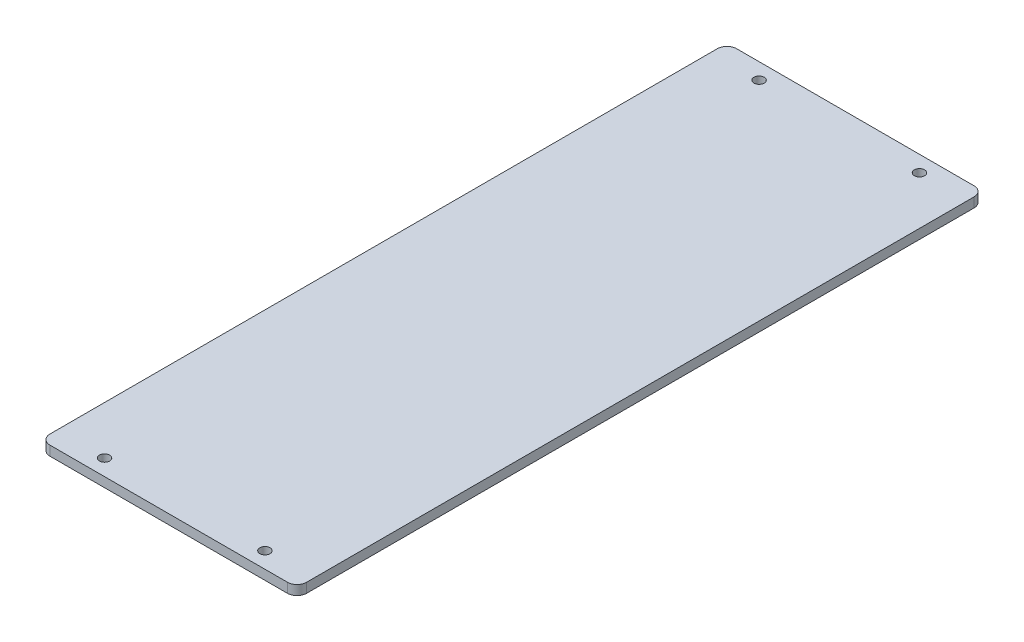
ISO-10303-21;
HEADER;
FILE_DESCRIPTION(('STEP AP214'),'2;1');
FILE_NAME('part.step','',(''),(''),'','','');
FILE_SCHEMA(('AUTOMOTIVE_DESIGN { 1 0 10303 214 1 1 1 1 }'));
ENDSEC;
DATA;
#1=APPLICATION_CONTEXT('core data for automotive mechanical design processes');
#2=APPLICATION_PROTOCOL_DEFINITION('international standard','automotive_design',2000,#1);
#3=PRODUCT_CONTEXT('',#1,'mechanical');
#4=PRODUCT('Part','Part','',(#3));
#5=PRODUCT_RELATED_PRODUCT_CATEGORY('part','',(#4));
#6=PRODUCT_DEFINITION_FORMATION('','',#4);
#7=PRODUCT_DEFINITION_CONTEXT('part definition',#1,'design');
#8=PRODUCT_DEFINITION('design','',#6,#7);
#9=PRODUCT_DEFINITION_SHAPE('','',#8);
#10=(LENGTH_UNIT() NAMED_UNIT(*) SI_UNIT(.MILLI.,.METRE.));
#11=(NAMED_UNIT(*) PLANE_ANGLE_UNIT() SI_UNIT($,.RADIAN.));
#12=(NAMED_UNIT(*) SI_UNIT($,.STERADIAN.) SOLID_ANGLE_UNIT());
#13=UNCERTAINTY_MEASURE_WITH_UNIT(LENGTH_MEASURE(1.E-05),#10,'distance_accuracy_value','');
#14=(GEOMETRIC_REPRESENTATION_CONTEXT(3) GLOBAL_UNCERTAINTY_ASSIGNED_CONTEXT((#13)) GLOBAL_UNIT_ASSIGNED_CONTEXT((#10,
#11,#12)) REPRESENTATION_CONTEXT('',''));
#15=CARTESIAN_POINT('',(0.,0.,0.));
#16=DIRECTION('',(0.,0.,1.));
#17=DIRECTION('',(1.,0.,0.));
#18=AXIS2_PLACEMENT_3D('',#15,#16,#17);
#19=CARTESIAN_POINT('',(37.,1.5,104.));
#20=DIRECTION('',(0.,-1.,0.));
#21=DIRECTION('',(0.,0.,-1.));
#22=AXIS2_PLACEMENT_3D('',#19,#20,#21);
#23=CYLINDRICAL_SURFACE('',#22,3.);
#24=CARTESIAN_POINT('',(37.,-1.5,104.));
#25=DIRECTION('',(0.,1.,0.));
#26=DIRECTION('',(0.,0.,1.));
#27=AXIS2_PLACEMENT_3D('',#24,#25,#26);
#28=CIRCLE('',#27,3.);
#29=CARTESIAN_POINT('',(37.,-1.5,107.));
#30=VERTEX_POINT('',#29);
#31=CARTESIAN_POINT('',(40.,-1.5,104.));
#32=VERTEX_POINT('',#31);
#33=EDGE_CURVE('E139',#30,#32,#28,.T.);
#34=ORIENTED_EDGE('',*,*,#33,.T.);
#35=DIRECTION('',(0.,-1.,0.));
#36=VECTOR('',#35,1.);
#37=CARTESIAN_POINT('',(40.,1.5,104.));
#38=LINE('',#37,#36);
#39=CARTESIAN_POINT('',(40.,1.5,104.));
#40=VERTEX_POINT('',#39);
#41=EDGE_CURVE('E11',#40,#32,#38,.T.);
#42=ORIENTED_EDGE('',*,*,#41,.F.);
#43=CARTESIAN_POINT('',(37.,1.5,104.));
#44=DIRECTION('',(0.,1.,0.));
#45=DIRECTION('',(0.,0.,1.));
#46=AXIS2_PLACEMENT_3D('',#43,#44,#45);
#47=CIRCLE('',#46,3.);
#48=CARTESIAN_POINT('',(37.,1.5,107.));
#49=VERTEX_POINT('',#48);
#50=EDGE_CURVE('E154',#49,#40,#47,.T.);
#51=ORIENTED_EDGE('',*,*,#50,.F.);
#52=DIRECTION('',(0.,-1.,0.));
#53=VECTOR('',#52,1.);
#54=CARTESIAN_POINT('',(37.,1.5,107.));
#55=LINE('',#54,#53);
#56=EDGE_CURVE('E135',#49,#30,#55,.T.);
#57=ORIENTED_EDGE('',*,*,#56,.T.);
#58=EDGE_LOOP('',(#34,#42,#51,#57));
#59=FACE_BOUND('',#58,.T.);
#60=ADVANCED_FACE('F43',(#59),#23,.T.);
#61=CARTESIAN_POINT('',(40.,1.5,-104.));
#62=DIRECTION('',(-1.,0.,0.));
#63=DIRECTION('',(0.,0.,1.));
#64=AXIS2_PLACEMENT_3D('',#61,#62,#63);
#65=PLANE('',#64);
#66=DIRECTION('',(0.,0.,-1.));
#67=VECTOR('',#66,1.);
#68=CARTESIAN_POINT('',(40.,-1.5,-104.));
#69=LINE('',#68,#67);
#70=CARTESIAN_POINT('',(40.,-1.5,-104.));
#71=VERTEX_POINT('',#70);
#72=EDGE_CURVE('E142',#32,#71,#69,.T.);
#73=ORIENTED_EDGE('',*,*,#72,.T.);
#74=DIRECTION('',(0.,-1.,0.));
#75=VECTOR('',#74,1.);
#76=CARTESIAN_POINT('',(40.,1.5,-104.));
#77=LINE('',#76,#75);
#78=CARTESIAN_POINT('',(40.,1.5,-104.));
#79=VERTEX_POINT('',#78);
#80=EDGE_CURVE('E51',#79,#71,#77,.T.);
#81=ORIENTED_EDGE('',*,*,#80,.F.);
#82=DIRECTION('',(0.,0.,-1.));
#83=VECTOR('',#82,1.);
#84=CARTESIAN_POINT('',(40.,1.5,-104.));
#85=LINE('',#84,#83);
#86=EDGE_CURVE('E102',#40,#79,#85,.T.);
#87=ORIENTED_EDGE('',*,*,#86,.F.);
#88=ORIENTED_EDGE('',*,*,#41,.T.);
#89=EDGE_LOOP('',(#73,#81,#87,#88));
#90=FACE_BOUND('',#89,.T.);
#91=ADVANCED_FACE('F236',(#90),#65,.F.);
#92=CARTESIAN_POINT('',(37.,1.5,-104.));
#93=DIRECTION('',(0.,-1.,0.));
#94=DIRECTION('',(0.,0.,-1.));
#95=AXIS2_PLACEMENT_3D('',#92,#93,#94);
#96=CYLINDRICAL_SURFACE('',#95,3.);
#97=CARTESIAN_POINT('',(37.,-1.5,-104.));
#98=DIRECTION('',(0.,1.,0.));
#99=DIRECTION('',(0.,0.,-1.));
#100=AXIS2_PLACEMENT_3D('',#97,#98,#99);
#101=CIRCLE('',#100,3.);
#102=CARTESIAN_POINT('',(37.,-1.5,-107.));
#103=VERTEX_POINT('',#102);
#104=EDGE_CURVE('E145',#71,#103,#101,.T.);
#105=ORIENTED_EDGE('',*,*,#104,.T.);
#106=DIRECTION('',(0.,-1.,0.));
#107=VECTOR('',#106,1.);
#108=CARTESIAN_POINT('',(37.,1.5,-107.));
#109=LINE('',#108,#107);
#110=CARTESIAN_POINT('',(37.,1.5,-107.));
#111=VERTEX_POINT('',#110);
#112=EDGE_CURVE('E161',#111,#103,#109,.T.);
#113=ORIENTED_EDGE('',*,*,#112,.F.);
#114=CARTESIAN_POINT('',(37.,1.5,-104.));
#115=DIRECTION('',(0.,1.,0.));
#116=DIRECTION('',(0.,0.,-1.));
#117=AXIS2_PLACEMENT_3D('',#114,#115,#116);
#118=CIRCLE('',#117,3.);
#119=EDGE_CURVE('E169',#79,#111,#118,.T.);
#120=ORIENTED_EDGE('',*,*,#119,.F.);
#121=ORIENTED_EDGE('',*,*,#80,.T.);
#122=EDGE_LOOP('',(#105,#113,#120,#121));
#123=FACE_BOUND('',#122,.T.);
#124=ADVANCED_FACE('F167',(#123),#96,.T.);
#125=CARTESIAN_POINT('',(-37.,1.5,-107.));
#126=DIRECTION('',(0.,0.,1.));
#127=DIRECTION('',(1.,0.,0.));
#128=AXIS2_PLACEMENT_3D('',#125,#126,#127);
#129=PLANE('',#128);
#130=DIRECTION('',(-1.,0.,0.));
#131=VECTOR('',#130,1.);
#132=CARTESIAN_POINT('',(-37.,-1.5,-107.));
#133=LINE('',#132,#131);
#134=CARTESIAN_POINT('',(-37.,-1.5,-107.));
#135=VERTEX_POINT('',#134);
#136=EDGE_CURVE('E147',#103,#135,#133,.T.);
#137=ORIENTED_EDGE('',*,*,#136,.T.);
#138=DIRECTION('',(0.,-1.,0.));
#139=VECTOR('',#138,1.);
#140=CARTESIAN_POINT('',(-37.,1.5,-107.));
#141=LINE('',#140,#139);
#142=CARTESIAN_POINT('',(-37.,1.5,-107.));
#143=VERTEX_POINT('',#142);
#144=EDGE_CURVE('E158',#143,#135,#141,.T.);
#145=ORIENTED_EDGE('',*,*,#144,.F.);
#146=DIRECTION('',(-1.,0.,0.));
#147=VECTOR('',#146,1.);
#148=CARTESIAN_POINT('',(-37.,1.5,-107.));
#149=LINE('',#148,#147);
#150=EDGE_CURVE('E181',#111,#143,#149,.T.);
#151=ORIENTED_EDGE('',*,*,#150,.F.);
#152=ORIENTED_EDGE('',*,*,#112,.T.);
#153=EDGE_LOOP('',(#137,#145,#151,#152));
#154=FACE_BOUND('',#153,.T.);
#155=ADVANCED_FACE('F177',(#154),#129,.F.);
#156=CARTESIAN_POINT('',(-37.,1.5,-104.));
#157=DIRECTION('',(0.,-1.,0.));
#158=DIRECTION('',(0.,0.,-1.));
#159=AXIS2_PLACEMENT_3D('',#156,#157,#158);
#160=CYLINDRICAL_SURFACE('',#159,3.);
#161=CARTESIAN_POINT('',(-37.,-1.5,-104.));
#162=DIRECTION('',(0.,1.,0.));
#163=DIRECTION('',(0.,0.,1.));
#164=AXIS2_PLACEMENT_3D('',#161,#162,#163);
#165=CIRCLE('',#164,3.);
#166=CARTESIAN_POINT('',(-40.,-1.5,-104.));
#167=VERTEX_POINT('',#166);
#168=EDGE_CURVE('E149',#135,#167,#165,.T.);
#169=ORIENTED_EDGE('',*,*,#168,.T.);
#170=DIRECTION('',(0.,-1.,0.));
#171=VECTOR('',#170,1.);
#172=CARTESIAN_POINT('',(-40.,1.5,-104.));
#173=LINE('',#172,#171);
#174=CARTESIAN_POINT('',(-40.,1.5,-104.));
#175=VERTEX_POINT('',#174);
#176=EDGE_CURVE('E130',#175,#167,#173,.T.);
#177=ORIENTED_EDGE('',*,*,#176,.F.);
#178=CARTESIAN_POINT('',(-37.,1.5,-104.));
#179=DIRECTION('',(0.,1.,0.));
#180=DIRECTION('',(0.,0.,1.));
#181=AXIS2_PLACEMENT_3D('',#178,#179,#180);
#182=CIRCLE('',#181,3.);
#183=EDGE_CURVE('E121',#143,#175,#182,.T.);
#184=ORIENTED_EDGE('',*,*,#183,.F.);
#185=ORIENTED_EDGE('',*,*,#144,.T.);
#186=EDGE_LOOP('',(#169,#177,#184,#185));
#187=FACE_BOUND('',#186,.T.);
#188=ADVANCED_FACE('F180',(#187),#160,.T.);
#189=CARTESIAN_POINT('',(-40.,1.5,-104.));
#190=DIRECTION('',(1.,0.,0.));
#191=DIRECTION('',(0.,0.,-1.));
#192=AXIS2_PLACEMENT_3D('',#189,#190,#191);
#193=PLANE('',#192);
#194=DIRECTION('',(0.,0.,1.));
#195=VECTOR('',#194,1.);
#196=CARTESIAN_POINT('',(-40.,-1.5,-104.));
#197=LINE('',#196,#195);
#198=CARTESIAN_POINT('',(-40.,-1.5,104.));
#199=VERTEX_POINT('',#198);
#200=EDGE_CURVE('E129',#167,#199,#197,.T.);
#201=ORIENTED_EDGE('',*,*,#200,.T.);
#202=DIRECTION('',(0.,-1.,0.));
#203=VECTOR('',#202,1.);
#204=CARTESIAN_POINT('',(-40.,1.5,104.));
#205=LINE('',#204,#203);
#206=CARTESIAN_POINT('',(-40.,1.5,104.));
#207=VERTEX_POINT('',#206);
#208=EDGE_CURVE('E126',#207,#199,#205,.T.);
#209=ORIENTED_EDGE('',*,*,#208,.F.);
#210=DIRECTION('',(0.,0.,1.));
#211=VECTOR('',#210,1.);
#212=CARTESIAN_POINT('',(-40.,1.5,-104.));
#213=LINE('',#212,#211);
#214=EDGE_CURVE('E115',#175,#207,#213,.T.);
#215=ORIENTED_EDGE('',*,*,#214,.F.);
#216=ORIENTED_EDGE('',*,*,#176,.T.);
#217=EDGE_LOOP('',(#201,#209,#215,#216));
#218=FACE_BOUND('',#217,.T.);
#219=ADVANCED_FACE('F127',(#218),#193,.F.);
#220=CARTESIAN_POINT('',(-37.,1.5,104.));
#221=DIRECTION('',(0.,-1.,0.));
#222=DIRECTION('',(0.,0.,-1.));
#223=AXIS2_PLACEMENT_3D('',#220,#221,#222);
#224=CYLINDRICAL_SURFACE('',#223,3.);
#225=CARTESIAN_POINT('',(-37.,-1.5,104.));
#226=DIRECTION('',(0.,1.,0.));
#227=DIRECTION('',(0.,0.,1.));
#228=AXIS2_PLACEMENT_3D('',#225,#226,#227);
#229=CIRCLE('',#228,3.);
#230=CARTESIAN_POINT('',(-37.,-1.5,107.));
#231=VERTEX_POINT('',#230);
#232=EDGE_CURVE('E88',#199,#231,#229,.T.);
#233=ORIENTED_EDGE('',*,*,#232,.T.);
#234=DIRECTION('',(0.,-1.,0.));
#235=VECTOR('',#234,1.);
#236=CARTESIAN_POINT('',(-37.,1.5,107.));
#237=LINE('',#236,#235);
#238=CARTESIAN_POINT('',(-37.,1.5,107.));
#239=VERTEX_POINT('',#238);
#240=EDGE_CURVE('E131',#239,#231,#237,.T.);
#241=ORIENTED_EDGE('',*,*,#240,.F.);
#242=CARTESIAN_POINT('',(-37.,1.5,104.));
#243=DIRECTION('',(0.,1.,0.));
#244=DIRECTION('',(0.,0.,1.));
#245=AXIS2_PLACEMENT_3D('',#242,#243,#244);
#246=CIRCLE('',#245,3.);
#247=EDGE_CURVE('E119',#207,#239,#246,.T.);
#248=ORIENTED_EDGE('',*,*,#247,.F.);
#249=ORIENTED_EDGE('',*,*,#208,.T.);
#250=EDGE_LOOP('',(#233,#241,#248,#249));
#251=FACE_BOUND('',#250,.T.);
#252=ADVANCED_FACE('F133',(#251),#224,.T.);
#253=CARTESIAN_POINT('',(-37.,1.5,107.));
#254=DIRECTION('',(0.,0.,-1.));
#255=DIRECTION('',(-1.,0.,0.));
#256=AXIS2_PLACEMENT_3D('',#253,#254,#255);
#257=PLANE('',#256);
#258=DIRECTION('',(1.,0.,0.));
#259=VECTOR('',#258,1.);
#260=CARTESIAN_POINT('',(-37.,-1.5,107.));
#261=LINE('',#260,#259);
#262=EDGE_CURVE('E94',#231,#30,#261,.T.);
#263=ORIENTED_EDGE('',*,*,#262,.T.);
#264=ORIENTED_EDGE('',*,*,#56,.F.);
#265=DIRECTION('',(1.,0.,0.));
#266=VECTOR('',#265,1.);
#267=CARTESIAN_POINT('',(-37.,1.5,107.));
#268=LINE('',#267,#266);
#269=EDGE_CURVE('E59',#239,#49,#268,.T.);
#270=ORIENTED_EDGE('',*,*,#269,.F.);
#271=ORIENTED_EDGE('',*,*,#240,.T.);
#272=EDGE_LOOP('',(#263,#264,#270,#271));
#273=FACE_BOUND('',#272,.T.);
#274=ADVANCED_FACE('F215',(#273),#257,.F.);
#275=CARTESIAN_POINT('',(37.,1.5,104.));
#276=DIRECTION('',(0.,1.,0.));
#277=DIRECTION('',(0.,0.,1.));
#278=AXIS2_PLACEMENT_3D('',#275,#276,#277);
#279=PLANE('',#278);
#280=CARTESIAN_POINT('',(-25.,1.5,-102.));
#281=DIRECTION('',(0.,1.,0.));
#282=DIRECTION('',(0.,0.,-1.));
#283=AXIS2_PLACEMENT_3D('',#280,#281,#282);
#284=CIRCLE('',#283,1.6);
#285=CARTESIAN_POINT('',(-25.,1.5,-103.6));
#286=VERTEX_POINT('',#285);
#287=EDGE_CURVE('E196',#286,#286,#284,.T.);
#288=ORIENTED_EDGE('',*,*,#287,.F.);
#289=EDGE_LOOP('',(#288));
#290=FACE_BOUND('',#289,.T.);
#291=CARTESIAN_POINT('',(25.,1.5,102.));
#292=DIRECTION('',(0.,1.,0.));
#293=DIRECTION('',(0.,0.,1.));
#294=AXIS2_PLACEMENT_3D('',#291,#292,#293);
#295=CIRCLE('',#294,1.6);
#296=CARTESIAN_POINT('',(25.,1.5,103.6));
#297=VERTEX_POINT('',#296);
#298=EDGE_CURVE('E202',#297,#297,#295,.T.);
#299=ORIENTED_EDGE('',*,*,#298,.F.);
#300=EDGE_LOOP('',(#299));
#301=FACE_BOUND('',#300,.T.);
#302=CARTESIAN_POINT('',(-25.,1.5,102.));
#303=DIRECTION('',(0.,1.,0.));
#304=DIRECTION('',(0.,0.,1.));
#305=AXIS2_PLACEMENT_3D('',#302,#303,#304);
#306=CIRCLE('',#305,1.6);
#307=CARTESIAN_POINT('',(-25.,1.5,103.6));
#308=VERTEX_POINT('',#307);
#309=EDGE_CURVE('E190',#308,#308,#306,.T.);
#310=ORIENTED_EDGE('',*,*,#309,.F.);
#311=EDGE_LOOP('',(#310));
#312=FACE_BOUND('',#311,.T.);
#313=CARTESIAN_POINT('',(25.,1.5,-102.));
#314=DIRECTION('',(0.,1.,0.));
#315=DIRECTION('',(0.,0.,-1.));
#316=AXIS2_PLACEMENT_3D('',#313,#314,#315);
#317=CIRCLE('',#316,1.6);
#318=CARTESIAN_POINT('',(25.,1.5,-103.6));
#319=VERTEX_POINT('',#318);
#320=EDGE_CURVE('E187',#319,#319,#317,.T.);
#321=ORIENTED_EDGE('',*,*,#320,.F.);
#322=EDGE_LOOP('',(#321));
#323=FACE_BOUND('',#322,.T.);
#324=ORIENTED_EDGE('',*,*,#50,.T.);
#325=ORIENTED_EDGE('',*,*,#86,.T.);
#326=ORIENTED_EDGE('',*,*,#119,.T.);
#327=ORIENTED_EDGE('',*,*,#150,.T.);
#328=ORIENTED_EDGE('',*,*,#183,.T.);
#329=ORIENTED_EDGE('',*,*,#214,.T.);
#330=ORIENTED_EDGE('',*,*,#247,.T.);
#331=ORIENTED_EDGE('',*,*,#269,.T.);
#332=EDGE_LOOP('',(#324,#325,#326,#327,#328,#329,#330,#331));
#333=FACE_BOUND('',#332,.T.);
#334=ADVANCED_FACE('F117',(#290,#301,#312,#323,#333),#279,.T.);
#335=CARTESIAN_POINT('',(37.,-1.5,104.));
#336=DIRECTION('',(0.,1.,0.));
#337=DIRECTION('',(0.,0.,1.));
#338=AXIS2_PLACEMENT_3D('',#335,#336,#337);
#339=PLANE('',#338);
#340=CARTESIAN_POINT('',(-25.,-1.5,-102.));
#341=DIRECTION('',(0.,1.,0.));
#342=DIRECTION('',(0.,0.,-1.));
#343=AXIS2_PLACEMENT_3D('',#340,#341,#342);
#344=CIRCLE('',#343,1.6);
#345=CARTESIAN_POINT('',(-25.,-1.5,-103.6));
#346=VERTEX_POINT('',#345);
#347=EDGE_CURVE('E193',#346,#346,#344,.T.);
#348=ORIENTED_EDGE('',*,*,#347,.T.);
#349=EDGE_LOOP('',(#348));
#350=FACE_BOUND('',#349,.T.);
#351=CARTESIAN_POINT('',(25.,-1.5,102.));
#352=DIRECTION('',(0.,1.,0.));
#353=DIRECTION('',(0.,0.,1.));
#354=AXIS2_PLACEMENT_3D('',#351,#352,#353);
#355=CIRCLE('',#354,1.6);
#356=CARTESIAN_POINT('',(25.,-1.5,103.6));
#357=VERTEX_POINT('',#356);
#358=EDGE_CURVE('E199',#357,#357,#355,.T.);
#359=ORIENTED_EDGE('',*,*,#358,.T.);
#360=EDGE_LOOP('',(#359));
#361=FACE_BOUND('',#360,.T.);
#362=CARTESIAN_POINT('',(-25.,-1.5,102.));
#363=DIRECTION('',(0.,1.,0.));
#364=DIRECTION('',(0.,0.,1.));
#365=AXIS2_PLACEMENT_3D('',#362,#363,#364);
#366=CIRCLE('',#365,1.6);
#367=CARTESIAN_POINT('',(-25.,-1.5,103.6));
#368=VERTEX_POINT('',#367);
#369=EDGE_CURVE('E205',#368,#368,#366,.T.);
#370=ORIENTED_EDGE('',*,*,#369,.T.);
#371=EDGE_LOOP('',(#370));
#372=FACE_BOUND('',#371,.T.);
#373=CARTESIAN_POINT('',(25.,-1.5,-102.));
#374=DIRECTION('',(0.,1.,0.));
#375=DIRECTION('',(0.,0.,-1.));
#376=AXIS2_PLACEMENT_3D('',#373,#374,#375);
#377=CIRCLE('',#376,1.6);
#378=CARTESIAN_POINT('',(25.,-1.5,-103.6));
#379=VERTEX_POINT('',#378);
#380=EDGE_CURVE('E143',#379,#379,#377,.T.);
#381=ORIENTED_EDGE('',*,*,#380,.T.);
#382=EDGE_LOOP('',(#381));
#383=FACE_BOUND('',#382,.T.);
#384=ORIENTED_EDGE('',*,*,#33,.F.);
#385=ORIENTED_EDGE('',*,*,#262,.F.);
#386=ORIENTED_EDGE('',*,*,#232,.F.);
#387=ORIENTED_EDGE('',*,*,#200,.F.);
#388=ORIENTED_EDGE('',*,*,#168,.F.);
#389=ORIENTED_EDGE('',*,*,#136,.F.);
#390=ORIENTED_EDGE('',*,*,#104,.F.);
#391=ORIENTED_EDGE('',*,*,#72,.F.);
#392=EDGE_LOOP('',(#384,#385,#386,#387,#388,#389,#390,#391));
#393=FACE_BOUND('',#392,.T.);
#394=ADVANCED_FACE('F173',(#350,#361,#372,#383,#393),#339,.F.);
#395=CARTESIAN_POINT('',(25.,-1.5,-102.));
#396=DIRECTION('',(0.,1.,0.));
#397=DIRECTION('',(0.,0.,1.));
#398=AXIS2_PLACEMENT_3D('',#395,#396,#397);
#399=CYLINDRICAL_SURFACE('',#398,1.6);
#400=ORIENTED_EDGE('',*,*,#380,.F.);
#401=EDGE_LOOP('',(#400));
#402=FACE_BOUND('',#401,.T.);
#403=ORIENTED_EDGE('',*,*,#320,.T.);
#404=EDGE_LOOP('',(#403));
#405=FACE_BOUND('',#404,.T.);
#406=ADVANCED_FACE('F220',(#402,#405),#399,.F.);
#407=CARTESIAN_POINT('',(-25.,-1.5,102.));
#408=DIRECTION('',(0.,1.,0.));
#409=DIRECTION('',(0.,0.,1.));
#410=AXIS2_PLACEMENT_3D('',#407,#408,#409);
#411=CYLINDRICAL_SURFACE('',#410,1.6);
#412=ORIENTED_EDGE('',*,*,#369,.F.);
#413=EDGE_LOOP('',(#412));
#414=FACE_BOUND('',#413,.T.);
#415=ORIENTED_EDGE('',*,*,#309,.T.);
#416=EDGE_LOOP('',(#415));
#417=FACE_BOUND('',#416,.T.);
#418=ADVANCED_FACE('F211',(#414,#417),#411,.F.);
#419=CARTESIAN_POINT('',(25.,-1.5,102.));
#420=DIRECTION('',(0.,1.,0.));
#421=DIRECTION('',(0.,0.,1.));
#422=AXIS2_PLACEMENT_3D('',#419,#420,#421);
#423=CYLINDRICAL_SURFACE('',#422,1.6);
#424=ORIENTED_EDGE('',*,*,#358,.F.);
#425=EDGE_LOOP('',(#424));
#426=FACE_BOUND('',#425,.T.);
#427=ORIENTED_EDGE('',*,*,#298,.T.);
#428=EDGE_LOOP('',(#427));
#429=FACE_BOUND('',#428,.T.);
#430=ADVANCED_FACE('F228',(#426,#429),#423,.F.);
#431=CARTESIAN_POINT('',(-25.,-1.5,-102.));
#432=DIRECTION('',(0.,1.,0.));
#433=DIRECTION('',(0.,0.,1.));
#434=AXIS2_PLACEMENT_3D('',#431,#432,#433);
#435=CYLINDRICAL_SURFACE('',#434,1.6);
#436=ORIENTED_EDGE('',*,*,#347,.F.);
#437=EDGE_LOOP('',(#436));
#438=FACE_BOUND('',#437,.T.);
#439=ORIENTED_EDGE('',*,*,#287,.T.);
#440=EDGE_LOOP('',(#439));
#441=FACE_BOUND('',#440,.T.);
#442=ADVANCED_FACE('F317',(#438,#441),#435,.F.);
#443=CLOSED_SHELL('',(#60,#91,#124,#155,#188,#219,#252,#274,#334,#394,#406,#418,#430,#442));
#444=MANIFOLD_SOLID_BREP('B2',#443);
#445=ADVANCED_BREP_SHAPE_REPRESENTATION('',(#18,#444),#14);
#446=SHAPE_DEFINITION_REPRESENTATION(#9,#445);
ENDSEC;
END-ISO-10303-21;
